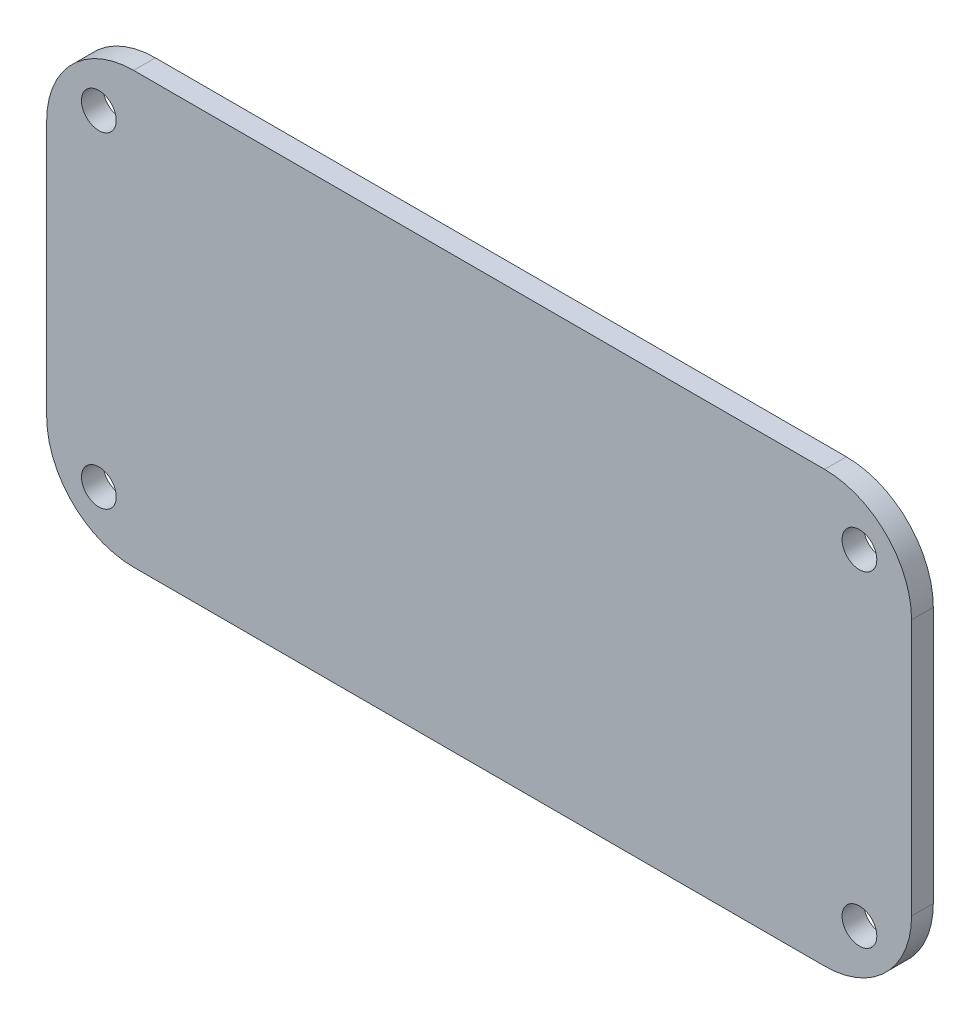
ISO-10303-21;
HEADER;
FILE_DESCRIPTION(('STEP AP214'),'2;1');
FILE_NAME('part.step','',(''),(''),'','','');
FILE_SCHEMA(('AUTOMOTIVE_DESIGN { 1 0 10303 214 1 1 1 1 }'));
ENDSEC;
DATA;
#1=APPLICATION_CONTEXT('core data for automotive mechanical design processes');
#2=APPLICATION_PROTOCOL_DEFINITION('international standard','automotive_design',2000,#1);
#3=PRODUCT_CONTEXT('',#1,'mechanical');
#4=PRODUCT('Part','Part','',(#3));
#5=PRODUCT_RELATED_PRODUCT_CATEGORY('part','',(#4));
#6=PRODUCT_DEFINITION_FORMATION('','',#4);
#7=PRODUCT_DEFINITION_CONTEXT('part definition',#1,'design');
#8=PRODUCT_DEFINITION('design','',#6,#7);
#9=PRODUCT_DEFINITION_SHAPE('','',#8);
#10=(LENGTH_UNIT() NAMED_UNIT(*) SI_UNIT(.MILLI.,.METRE.));
#11=(NAMED_UNIT(*) PLANE_ANGLE_UNIT() SI_UNIT($,.RADIAN.));
#12=(NAMED_UNIT(*) SI_UNIT($,.STERADIAN.) SOLID_ANGLE_UNIT());
#13=UNCERTAINTY_MEASURE_WITH_UNIT(LENGTH_MEASURE(1.E-05),#10,'distance_accuracy_value','');
#14=(GEOMETRIC_REPRESENTATION_CONTEXT(3) GLOBAL_UNCERTAINTY_ASSIGNED_CONTEXT((#13)) GLOBAL_UNIT_ASSIGNED_CONTEXT((#10,
#11,#12)) REPRESENTATION_CONTEXT('',''));
#15=CARTESIAN_POINT('',(0.,0.,0.));
#16=DIRECTION('',(0.,0.,1.));
#17=DIRECTION('',(1.,0.,0.));
#18=AXIS2_PLACEMENT_3D('',#15,#16,#17);
#19=CARTESIAN_POINT('',(31.8,-11.8,2.));
#20=DIRECTION('',(0.,0.,1.));
#21=DIRECTION('',(1.,0.,0.));
#22=AXIS2_PLACEMENT_3D('',#19,#20,#21);
#23=PLANE('',#22);
#24=CARTESIAN_POINT('',(35.,-15.,2.));
#25=DIRECTION('',(0.,0.,1.));
#26=DIRECTION('',(1.,0.,0.));
#27=AXIS2_PLACEMENT_3D('',#24,#25,#26);
#28=CIRCLE('',#27,1.6);
#29=CARTESIAN_POINT('',(36.6,-15.,2.));
#30=VERTEX_POINT('',#29);
#31=EDGE_CURVE('E187',#30,#30,#28,.T.);
#32=ORIENTED_EDGE('',*,*,#31,.F.);
#33=EDGE_LOOP('',(#32));
#34=FACE_BOUND('',#33,.T.);
#35=CARTESIAN_POINT('',(-35.,15.,2.));
#36=DIRECTION('',(0.,0.,1.));
#37=DIRECTION('',(1.,0.,0.));
#38=AXIS2_PLACEMENT_3D('',#35,#36,#37);
#39=CIRCLE('',#38,1.6);
#40=CARTESIAN_POINT('',(-33.4,15.,2.));
#41=VERTEX_POINT('',#40);
#42=EDGE_CURVE('E133',#41,#41,#39,.T.);
#43=ORIENTED_EDGE('',*,*,#42,.F.);
#44=EDGE_LOOP('',(#43));
#45=FACE_BOUND('',#44,.T.);
#46=CARTESIAN_POINT('',(31.8,-11.8,2.));
#47=DIRECTION('',(0.,0.,1.));
#48=DIRECTION('',(1.,0.,0.));
#49=AXIS2_PLACEMENT_3D('',#46,#47,#48);
#50=CIRCLE('',#49,7.99999999999999);
#51=CARTESIAN_POINT('',(31.8,-19.8,2.));
#52=VERTEX_POINT('',#51);
#53=CARTESIAN_POINT('',(39.8,-11.8,2.));
#54=VERTEX_POINT('',#53);
#55=EDGE_CURVE('E144',#52,#54,#50,.T.);
#56=ORIENTED_EDGE('',*,*,#55,.T.);
#57=DIRECTION('',(0.,1.,0.));
#58=VECTOR('',#57,1.);
#59=CARTESIAN_POINT('',(39.8,-11.8,2.));
#60=LINE('',#59,#58);
#61=CARTESIAN_POINT('',(39.8,11.8,2.));
#62=VERTEX_POINT('',#61);
#63=EDGE_CURVE('E92',#54,#62,#60,.T.);
#64=ORIENTED_EDGE('',*,*,#63,.T.);
#65=CARTESIAN_POINT('',(31.8,11.8,2.));
#66=DIRECTION('',(0.,0.,1.));
#67=DIRECTION('',(1.,0.,0.));
#68=AXIS2_PLACEMENT_3D('',#65,#66,#67);
#69=CIRCLE('',#68,8.);
#70=CARTESIAN_POINT('',(31.8,19.8,2.));
#71=VERTEX_POINT('',#70);
#72=EDGE_CURVE('E159',#62,#71,#69,.T.);
#73=ORIENTED_EDGE('',*,*,#72,.T.);
#74=DIRECTION('',(-1.,0.,0.));
#75=VECTOR('',#74,1.);
#76=CARTESIAN_POINT('',(31.8,19.8,2.));
#77=LINE('',#76,#75);
#78=CARTESIAN_POINT('',(-31.8,19.8,2.));
#79=VERTEX_POINT('',#78);
#80=EDGE_CURVE('E172',#71,#79,#77,.T.);
#81=ORIENTED_EDGE('',*,*,#80,.T.);
#82=CARTESIAN_POINT('',(-31.8,11.8,2.));
#83=DIRECTION('',(0.,0.,1.));
#84=DIRECTION('',(1.,0.,0.));
#85=AXIS2_PLACEMENT_3D('',#82,#83,#84);
#86=CIRCLE('',#85,8.00000000000001);
#87=CARTESIAN_POINT('',(-39.8,11.8,2.));
#88=VERTEX_POINT('',#87);
#89=EDGE_CURVE('E111',#79,#88,#86,.T.);
#90=ORIENTED_EDGE('',*,*,#89,.T.);
#91=DIRECTION('',(0.,-1.,0.));
#92=VECTOR('',#91,1.);
#93=CARTESIAN_POINT('',(-39.8,11.8,2.));
#94=LINE('',#93,#92);
#95=CARTESIAN_POINT('',(-39.8,-11.8,2.));
#96=VERTEX_POINT('',#95);
#97=EDGE_CURVE('E105',#88,#96,#94,.T.);
#98=ORIENTED_EDGE('',*,*,#97,.T.);
#99=CARTESIAN_POINT('',(-31.8,-11.8,2.));
#100=DIRECTION('',(0.,0.,1.));
#101=DIRECTION('',(1.,0.,0.));
#102=AXIS2_PLACEMENT_3D('',#99,#100,#101);
#103=CIRCLE('',#102,8.);
#104=CARTESIAN_POINT('',(-31.8,-19.8,2.));
#105=VERTEX_POINT('',#104);
#106=EDGE_CURVE('E109',#96,#105,#103,.T.);
#107=ORIENTED_EDGE('',*,*,#106,.T.);
#108=DIRECTION('',(1.,0.,0.));
#109=VECTOR('',#108,1.);
#110=CARTESIAN_POINT('',(-31.8,-19.8,2.));
#111=LINE('',#110,#109);
#112=EDGE_CURVE('E49',#105,#52,#111,.T.);
#113=ORIENTED_EDGE('',*,*,#112,.T.);
#114=EDGE_LOOP('',(#56,#64,#73,#81,#90,#98,#107,#113));
#115=FACE_BOUND('',#114,.T.);
#116=CARTESIAN_POINT('',(35.,15.,2.));
#117=DIRECTION('',(0.,0.,1.));
#118=DIRECTION('',(1.,0.,0.));
#119=AXIS2_PLACEMENT_3D('',#116,#117,#118);
#120=CIRCLE('',#119,1.6);
#121=CARTESIAN_POINT('',(36.6,15.,2.));
#122=VERTEX_POINT('',#121);
#123=EDGE_CURVE('E181',#122,#122,#120,.T.);
#124=ORIENTED_EDGE('',*,*,#123,.F.);
#125=EDGE_LOOP('',(#124));
#126=FACE_BOUND('',#125,.T.);
#127=CARTESIAN_POINT('',(-35.,-15.,2.));
#128=DIRECTION('',(0.,0.,1.));
#129=DIRECTION('',(1.,0.,0.));
#130=AXIS2_PLACEMENT_3D('',#127,#128,#129);
#131=CIRCLE('',#130,1.6);
#132=CARTESIAN_POINT('',(-33.4,-15.,2.));
#133=VERTEX_POINT('',#132);
#134=EDGE_CURVE('E193',#133,#133,#131,.T.);
#135=ORIENTED_EDGE('',*,*,#134,.F.);
#136=EDGE_LOOP('',(#135));
#137=FACE_BOUND('',#136,.T.);
#138=ADVANCED_FACE('F32',(#34,#45,#115,#126,#137),#23,.T.);
#139=CARTESIAN_POINT('',(31.8,-11.8,0.));
#140=DIRECTION('',(0.,0.,1.));
#141=DIRECTION('',(1.,0.,0.));
#142=AXIS2_PLACEMENT_3D('',#139,#140,#141);
#143=PLANE('',#142);
#144=CARTESIAN_POINT('',(31.8,-11.8,0.));
#145=DIRECTION('',(0.,0.,1.));
#146=DIRECTION('',(1.,0.,0.));
#147=AXIS2_PLACEMENT_3D('',#144,#145,#146);
#148=CIRCLE('',#147,7.99999999999999);
#149=CARTESIAN_POINT('',(31.8,-19.8,0.));
#150=VERTEX_POINT('',#149);
#151=CARTESIAN_POINT('',(39.8,-11.8,0.));
#152=VERTEX_POINT('',#151);
#153=EDGE_CURVE('E129',#150,#152,#148,.T.);
#154=ORIENTED_EDGE('',*,*,#153,.F.);
#155=DIRECTION('',(1.,0.,0.));
#156=VECTOR('',#155,1.);
#157=CARTESIAN_POINT('',(-31.8,-19.8,0.));
#158=LINE('',#157,#156);
#159=CARTESIAN_POINT('',(-31.8,-19.8,0.));
#160=VERTEX_POINT('',#159);
#161=EDGE_CURVE('E84',#160,#150,#158,.T.);
#162=ORIENTED_EDGE('',*,*,#161,.F.);
#163=CARTESIAN_POINT('',(-31.8,-11.8,0.));
#164=DIRECTION('',(0.,0.,1.));
#165=DIRECTION('',(1.,0.,0.));
#166=AXIS2_PLACEMENT_3D('',#163,#164,#165);
#167=CIRCLE('',#166,8.);
#168=CARTESIAN_POINT('',(-39.8,-11.8,0.));
#169=VERTEX_POINT('',#168);
#170=EDGE_CURVE('E78',#169,#160,#167,.T.);
#171=ORIENTED_EDGE('',*,*,#170,.F.);
#172=DIRECTION('',(0.,-1.,0.));
#173=VECTOR('',#172,1.);
#174=CARTESIAN_POINT('',(-39.8,11.8,0.));
#175=LINE('',#174,#173);
#176=CARTESIAN_POINT('',(-39.8,11.8,0.));
#177=VERTEX_POINT('',#176);
#178=EDGE_CURVE('E119',#177,#169,#175,.T.);
#179=ORIENTED_EDGE('',*,*,#178,.F.);
#180=CARTESIAN_POINT('',(-31.8,11.8,0.));
#181=DIRECTION('',(0.,0.,1.));
#182=DIRECTION('',(1.,0.,0.));
#183=AXIS2_PLACEMENT_3D('',#180,#181,#182);
#184=CIRCLE('',#183,8.00000000000001);
#185=CARTESIAN_POINT('',(-31.8,19.8,0.));
#186=VERTEX_POINT('',#185);
#187=EDGE_CURVE('E139',#186,#177,#184,.T.);
#188=ORIENTED_EDGE('',*,*,#187,.F.);
#189=DIRECTION('',(-1.,0.,0.));
#190=VECTOR('',#189,1.);
#191=CARTESIAN_POINT('',(31.8,19.8,0.));
#192=LINE('',#191,#190);
#193=CARTESIAN_POINT('',(31.8,19.8,0.));
#194=VERTEX_POINT('',#193);
#195=EDGE_CURVE('E137',#194,#186,#192,.T.);
#196=ORIENTED_EDGE('',*,*,#195,.F.);
#197=CARTESIAN_POINT('',(31.8,11.8,0.));
#198=DIRECTION('',(0.,0.,1.));
#199=DIRECTION('',(1.,0.,0.));
#200=AXIS2_PLACEMENT_3D('',#197,#198,#199);
#201=CIRCLE('',#200,8.);
#202=CARTESIAN_POINT('',(39.8,11.8,0.));
#203=VERTEX_POINT('',#202);
#204=EDGE_CURVE('E135',#203,#194,#201,.T.);
#205=ORIENTED_EDGE('',*,*,#204,.F.);
#206=DIRECTION('',(0.,1.,0.));
#207=VECTOR('',#206,1.);
#208=CARTESIAN_POINT('',(39.8,-11.8,0.));
#209=LINE('',#208,#207);
#210=EDGE_CURVE('E132',#152,#203,#209,.T.);
#211=ORIENTED_EDGE('',*,*,#210,.F.);
#212=EDGE_LOOP('',(#154,#162,#171,#179,#188,#196,#205,#211));
#213=FACE_BOUND('',#212,.T.);
#214=CARTESIAN_POINT('',(-35.,15.,0.));
#215=DIRECTION('',(0.,0.,1.));
#216=DIRECTION('',(1.,0.,0.));
#217=AXIS2_PLACEMENT_3D('',#214,#215,#216);
#218=CIRCLE('',#217,1.6);
#219=CARTESIAN_POINT('',(-33.4,15.,0.));
#220=VERTEX_POINT('',#219);
#221=EDGE_CURVE('E178',#220,#220,#218,.T.);
#222=ORIENTED_EDGE('',*,*,#221,.T.);
#223=EDGE_LOOP('',(#222));
#224=FACE_BOUND('',#223,.T.);
#225=CARTESIAN_POINT('',(35.,15.,0.));
#226=DIRECTION('',(0.,0.,1.));
#227=DIRECTION('',(1.,0.,0.));
#228=AXIS2_PLACEMENT_3D('',#225,#226,#227);
#229=CIRCLE('',#228,1.6);
#230=CARTESIAN_POINT('',(36.6,15.,0.));
#231=VERTEX_POINT('',#230);
#232=EDGE_CURVE('E184',#231,#231,#229,.T.);
#233=ORIENTED_EDGE('',*,*,#232,.T.);
#234=EDGE_LOOP('',(#233));
#235=FACE_BOUND('',#234,.T.);
#236=CARTESIAN_POINT('',(35.,-15.,0.));
#237=DIRECTION('',(0.,0.,1.));
#238=DIRECTION('',(1.,0.,0.));
#239=AXIS2_PLACEMENT_3D('',#236,#237,#238);
#240=CIRCLE('',#239,1.6);
#241=CARTESIAN_POINT('',(36.6,-15.,0.));
#242=VERTEX_POINT('',#241);
#243=EDGE_CURVE('E190',#242,#242,#240,.T.);
#244=ORIENTED_EDGE('',*,*,#243,.T.);
#245=EDGE_LOOP('',(#244));
#246=FACE_BOUND('',#245,.T.);
#247=CARTESIAN_POINT('',(-35.,-15.,0.));
#248=DIRECTION('',(0.,0.,1.));
#249=DIRECTION('',(1.,0.,0.));
#250=AXIS2_PLACEMENT_3D('',#247,#248,#249);
#251=CIRCLE('',#250,1.6);
#252=CARTESIAN_POINT('',(-33.4,-15.,0.));
#253=VERTEX_POINT('',#252);
#254=EDGE_CURVE('E196',#253,#253,#251,.T.);
#255=ORIENTED_EDGE('',*,*,#254,.T.);
#256=EDGE_LOOP('',(#255));
#257=FACE_BOUND('',#256,.T.);
#258=ADVANCED_FACE('F163',(#213,#224,#235,#246,#257),#143,.F.);
#259=CARTESIAN_POINT('',(31.8,-11.8,2.));
#260=DIRECTION('',(0.,0.,-1.));
#261=DIRECTION('',(-1.,0.,0.));
#262=AXIS2_PLACEMENT_3D('',#259,#260,#261);
#263=CYLINDRICAL_SURFACE('',#262,7.99999999999999);
#264=ORIENTED_EDGE('',*,*,#153,.T.);
#265=DIRECTION('',(0.,0.,-1.));
#266=VECTOR('',#265,1.);
#267=CARTESIAN_POINT('',(39.8,-11.8,2.));
#268=LINE('',#267,#266);
#269=EDGE_CURVE('E11',#54,#152,#268,.T.);
#270=ORIENTED_EDGE('',*,*,#269,.F.);
#271=ORIENTED_EDGE('',*,*,#55,.F.);
#272=DIRECTION('',(0.,0.,-1.));
#273=VECTOR('',#272,1.);
#274=CARTESIAN_POINT('',(31.8,-19.8,2.));
#275=LINE('',#274,#273);
#276=EDGE_CURVE('E125',#52,#150,#275,.T.);
#277=ORIENTED_EDGE('',*,*,#276,.T.);
#278=EDGE_LOOP('',(#264,#270,#271,#277));
#279=FACE_BOUND('',#278,.T.);
#280=ADVANCED_FACE('F34',(#279),#263,.T.);
#281=CARTESIAN_POINT('',(39.8,-11.8,2.));
#282=DIRECTION('',(-1.,0.,0.));
#283=DIRECTION('',(0.,-1.,0.));
#284=AXIS2_PLACEMENT_3D('',#281,#282,#283);
#285=PLANE('',#284);
#286=ORIENTED_EDGE('',*,*,#210,.T.);
#287=DIRECTION('',(0.,0.,-1.));
#288=VECTOR('',#287,1.);
#289=CARTESIAN_POINT('',(39.8,11.8,2.));
#290=LINE('',#289,#288);
#291=EDGE_CURVE('E41',#62,#203,#290,.T.);
#292=ORIENTED_EDGE('',*,*,#291,.F.);
#293=ORIENTED_EDGE('',*,*,#63,.F.);
#294=ORIENTED_EDGE('',*,*,#269,.T.);
#295=EDGE_LOOP('',(#286,#292,#293,#294));
#296=FACE_BOUND('',#295,.T.);
#297=ADVANCED_FACE('F230',(#296),#285,.F.);
#298=CARTESIAN_POINT('',(31.8,11.8,2.));
#299=DIRECTION('',(0.,0.,-1.));
#300=DIRECTION('',(-1.,0.,0.));
#301=AXIS2_PLACEMENT_3D('',#298,#299,#300);
#302=CYLINDRICAL_SURFACE('',#301,8.);
#303=ORIENTED_EDGE('',*,*,#204,.T.);
#304=DIRECTION('',(0.,0.,-1.));
#305=VECTOR('',#304,1.);
#306=CARTESIAN_POINT('',(31.8,19.8,2.));
#307=LINE('',#306,#305);
#308=EDGE_CURVE('E151',#71,#194,#307,.T.);
#309=ORIENTED_EDGE('',*,*,#308,.F.);
#310=ORIENTED_EDGE('',*,*,#72,.F.);
#311=ORIENTED_EDGE('',*,*,#291,.T.);
#312=EDGE_LOOP('',(#303,#309,#310,#311));
#313=FACE_BOUND('',#312,.T.);
#314=ADVANCED_FACE('F157',(#313),#302,.T.);
#315=CARTESIAN_POINT('',(31.8,19.8,2.));
#316=DIRECTION('',(0.,-1.,0.));
#317=DIRECTION('',(1.,0.,0.));
#318=AXIS2_PLACEMENT_3D('',#315,#316,#317);
#319=PLANE('',#318);
#320=ORIENTED_EDGE('',*,*,#195,.T.);
#321=DIRECTION('',(0.,0.,-1.));
#322=VECTOR('',#321,1.);
#323=CARTESIAN_POINT('',(-31.8,19.8,2.));
#324=LINE('',#323,#322);
#325=EDGE_CURVE('E148',#79,#186,#324,.T.);
#326=ORIENTED_EDGE('',*,*,#325,.F.);
#327=ORIENTED_EDGE('',*,*,#80,.F.);
#328=ORIENTED_EDGE('',*,*,#308,.T.);
#329=EDGE_LOOP('',(#320,#326,#327,#328));
#330=FACE_BOUND('',#329,.T.);
#331=ADVANCED_FACE('F168',(#330),#319,.F.);
#332=CARTESIAN_POINT('',(-31.8,11.8,2.));
#333=DIRECTION('',(0.,0.,-1.));
#334=DIRECTION('',(-1.,0.,0.));
#335=AXIS2_PLACEMENT_3D('',#332,#333,#334);
#336=CYLINDRICAL_SURFACE('',#335,8.00000000000001);
#337=ORIENTED_EDGE('',*,*,#187,.T.);
#338=DIRECTION('',(0.,0.,-1.));
#339=VECTOR('',#338,1.);
#340=CARTESIAN_POINT('',(-39.8,11.8,2.));
#341=LINE('',#340,#339);
#342=EDGE_CURVE('E120',#88,#177,#341,.T.);
#343=ORIENTED_EDGE('',*,*,#342,.F.);
#344=ORIENTED_EDGE('',*,*,#89,.F.);
#345=ORIENTED_EDGE('',*,*,#325,.T.);
#346=EDGE_LOOP('',(#337,#343,#344,#345));
#347=FACE_BOUND('',#346,.T.);
#348=ADVANCED_FACE('F171',(#347),#336,.T.);
#349=CARTESIAN_POINT('',(-39.8,11.8,2.));
#350=DIRECTION('',(1.,0.,0.));
#351=DIRECTION('',(0.,0.,-1.));
#352=AXIS2_PLACEMENT_3D('',#349,#350,#351);
#353=PLANE('',#352);
#354=ORIENTED_EDGE('',*,*,#178,.T.);
#355=DIRECTION('',(0.,0.,-1.));
#356=VECTOR('',#355,1.);
#357=CARTESIAN_POINT('',(-39.8,-11.8,2.));
#358=LINE('',#357,#356);
#359=EDGE_CURVE('E116',#96,#169,#358,.T.);
#360=ORIENTED_EDGE('',*,*,#359,.F.);
#361=ORIENTED_EDGE('',*,*,#97,.F.);
#362=ORIENTED_EDGE('',*,*,#342,.T.);
#363=EDGE_LOOP('',(#354,#360,#361,#362));
#364=FACE_BOUND('',#363,.T.);
#365=ADVANCED_FACE('F117',(#364),#353,.F.);
#366=CARTESIAN_POINT('',(-31.8,-11.8,2.));
#367=DIRECTION('',(0.,0.,-1.));
#368=DIRECTION('',(-1.,0.,0.));
#369=AXIS2_PLACEMENT_3D('',#366,#367,#368);
#370=CYLINDRICAL_SURFACE('',#369,8.);
#371=ORIENTED_EDGE('',*,*,#170,.T.);
#372=DIRECTION('',(0.,0.,-1.));
#373=VECTOR('',#372,1.);
#374=CARTESIAN_POINT('',(-31.8,-19.8,2.));
#375=LINE('',#374,#373);
#376=EDGE_CURVE('E121',#105,#160,#375,.T.);
#377=ORIENTED_EDGE('',*,*,#376,.F.);
#378=ORIENTED_EDGE('',*,*,#106,.F.);
#379=ORIENTED_EDGE('',*,*,#359,.T.);
#380=EDGE_LOOP('',(#371,#377,#378,#379));
#381=FACE_BOUND('',#380,.T.);
#382=ADVANCED_FACE('F123',(#381),#370,.T.);
#383=CARTESIAN_POINT('',(-31.8,-19.8,2.));
#384=DIRECTION('',(0.,1.,0.));
#385=DIRECTION('',(-1.,0.,0.));
#386=AXIS2_PLACEMENT_3D('',#383,#384,#385);
#387=PLANE('',#386);
#388=ORIENTED_EDGE('',*,*,#161,.T.);
#389=ORIENTED_EDGE('',*,*,#276,.F.);
#390=ORIENTED_EDGE('',*,*,#112,.F.);
#391=ORIENTED_EDGE('',*,*,#376,.T.);
#392=EDGE_LOOP('',(#388,#389,#390,#391));
#393=FACE_BOUND('',#392,.T.);
#394=ADVANCED_FACE('F218',(#393),#387,.F.);
#395=CARTESIAN_POINT('',(-35.,15.,2.));
#396=DIRECTION('',(0.,0.,-1.));
#397=DIRECTION('',(-1.,0.,0.));
#398=AXIS2_PLACEMENT_3D('',#395,#396,#397);
#399=CYLINDRICAL_SURFACE('',#398,1.6);
#400=ORIENTED_EDGE('',*,*,#42,.T.);
#401=EDGE_LOOP('',(#400));
#402=FACE_BOUND('',#401,.T.);
#403=ORIENTED_EDGE('',*,*,#221,.F.);
#404=EDGE_LOOP('',(#403));
#405=FACE_BOUND('',#404,.T.);
#406=ADVANCED_FACE('F215',(#402,#405),#399,.F.);
#407=CARTESIAN_POINT('',(35.,15.,2.));
#408=DIRECTION('',(0.,0.,-1.));
#409=DIRECTION('',(-1.,0.,0.));
#410=AXIS2_PLACEMENT_3D('',#407,#408,#409);
#411=CYLINDRICAL_SURFACE('',#410,1.6);
#412=ORIENTED_EDGE('',*,*,#123,.T.);
#413=EDGE_LOOP('',(#412));
#414=FACE_BOUND('',#413,.T.);
#415=ORIENTED_EDGE('',*,*,#232,.F.);
#416=EDGE_LOOP('',(#415));
#417=FACE_BOUND('',#416,.T.);
#418=ADVANCED_FACE('F294',(#414,#417),#411,.F.);
#419=CARTESIAN_POINT('',(35.,-15.,2.));
#420=DIRECTION('',(0.,0.,-1.));
#421=DIRECTION('',(-1.,0.,0.));
#422=AXIS2_PLACEMENT_3D('',#419,#420,#421);
#423=CYLINDRICAL_SURFACE('',#422,1.6);
#424=ORIENTED_EDGE('',*,*,#31,.T.);
#425=EDGE_LOOP('',(#424));
#426=FACE_BOUND('',#425,.T.);
#427=ORIENTED_EDGE('',*,*,#243,.F.);
#428=EDGE_LOOP('',(#427));
#429=FACE_BOUND('',#428,.T.);
#430=ADVANCED_FACE('F302',(#426,#429),#423,.F.);
#431=CARTESIAN_POINT('',(-35.,-15.,2.));
#432=DIRECTION('',(0.,0.,-1.));
#433=DIRECTION('',(-1.,0.,0.));
#434=AXIS2_PLACEMENT_3D('',#431,#432,#433);
#435=CYLINDRICAL_SURFACE('',#434,1.6);
#436=ORIENTED_EDGE('',*,*,#134,.T.);
#437=EDGE_LOOP('',(#436));
#438=FACE_BOUND('',#437,.T.);
#439=ORIENTED_EDGE('',*,*,#254,.F.);
#440=EDGE_LOOP('',(#439));
#441=FACE_BOUND('',#440,.T.);
#442=ADVANCED_FACE('F202',(#438,#441),#435,.F.);
#443=CLOSED_SHELL('',(#138,#258,#280,#297,#314,#331,#348,#365,#382,#394,#406,#418,#430,#442));
#444=MANIFOLD_SOLID_BREP('B2',#443);
#445=ADVANCED_BREP_SHAPE_REPRESENTATION('',(#18,#444),#14);
#446=SHAPE_DEFINITION_REPRESENTATION(#9,#445);
ENDSEC;
END-ISO-10303-21;
